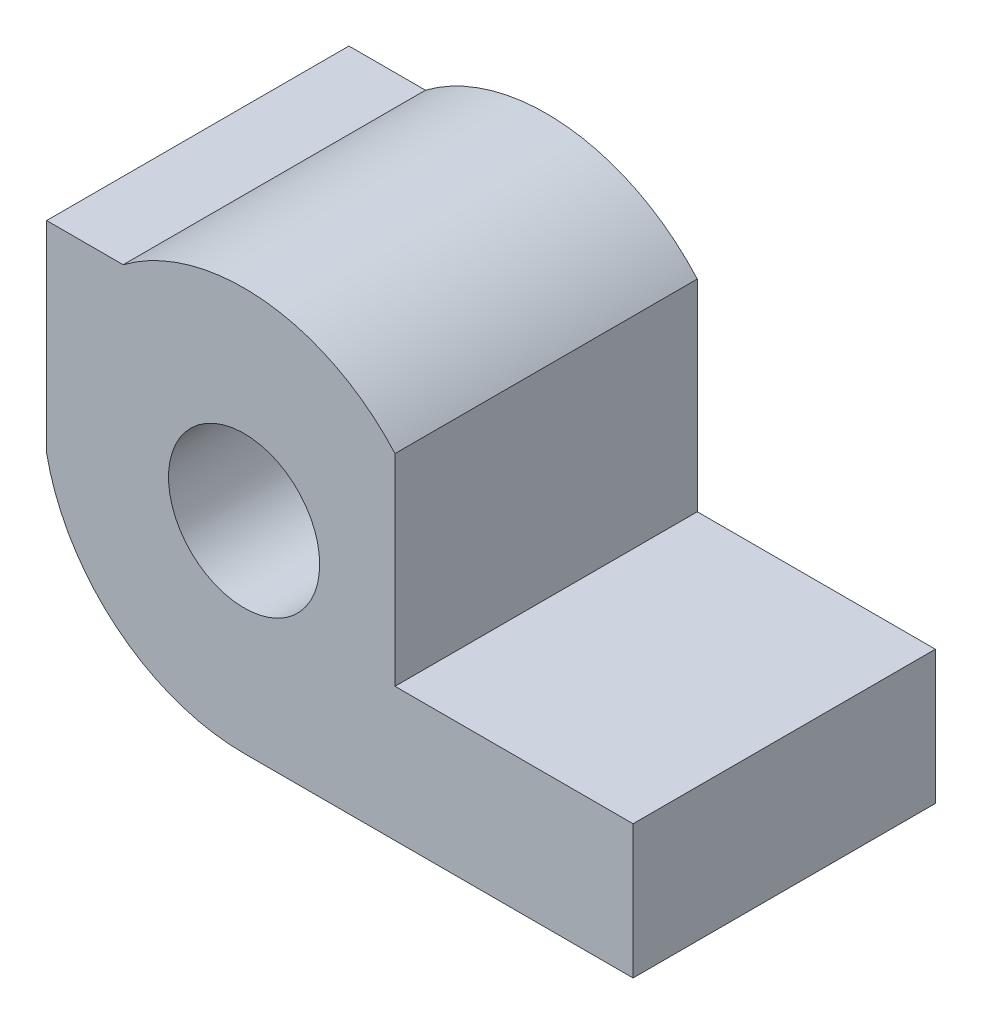
ISO-10303-21;
HEADER;
FILE_DESCRIPTION(('STEP AP214'),'2;1');
FILE_NAME('part.step','',(''),(''),'','','');
FILE_SCHEMA(('AUTOMOTIVE_DESIGN { 1 0 10303 214 1 1 1 1 }'));
ENDSEC;
DATA;
#1=APPLICATION_CONTEXT('core data for automotive mechanical design processes');
#2=APPLICATION_PROTOCOL_DEFINITION('international standard','automotive_design',2000,#1);
#3=PRODUCT_CONTEXT('',#1,'mechanical');
#4=PRODUCT('Part','Part','',(#3));
#5=PRODUCT_RELATED_PRODUCT_CATEGORY('part','',(#4));
#6=PRODUCT_DEFINITION_FORMATION('','',#4);
#7=PRODUCT_DEFINITION_CONTEXT('part definition',#1,'design');
#8=PRODUCT_DEFINITION('design','',#6,#7);
#9=PRODUCT_DEFINITION_SHAPE('','',#8);
#10=(LENGTH_UNIT() NAMED_UNIT(*) SI_UNIT(.MILLI.,.METRE.));
#11=(NAMED_UNIT(*) PLANE_ANGLE_UNIT() SI_UNIT($,.RADIAN.));
#12=(NAMED_UNIT(*) SI_UNIT($,.STERADIAN.) SOLID_ANGLE_UNIT());
#13=UNCERTAINTY_MEASURE_WITH_UNIT(LENGTH_MEASURE(1.E-05),#10,'distance_accuracy_value','');
#14=(GEOMETRIC_REPRESENTATION_CONTEXT(3) GLOBAL_UNCERTAINTY_ASSIGNED_CONTEXT((#13)) GLOBAL_UNIT_ASSIGNED_CONTEXT((#10,
#11,#12)) REPRESENTATION_CONTEXT('',''));
#15=CARTESIAN_POINT('',(0.,0.,0.));
#16=DIRECTION('',(0.,0.,1.));
#17=DIRECTION('',(1.,0.,0.));
#18=AXIS2_PLACEMENT_3D('',#15,#16,#17);
#19=CARTESIAN_POINT('',(0.599591794226535,0.,6.));
#20=DIRECTION('',(0.,0.,1.));
#21=DIRECTION('',(1.,0.,0.));
#22=AXIS2_PLACEMENT_3D('',#19,#20,#21);
#23=PLANE('',#22);
#24=CARTESIAN_POINT('',(0.599591794226535,0.,6.));
#25=DIRECTION('',(0.,0.,1.));
#26=DIRECTION('',(1.,0.,0.));
#27=AXIS2_PLACEMENT_3D('',#24,#25,#26);
#28=CIRCLE('',#27,4.);
#29=CARTESIAN_POINT('',(-3.31959179422655,-0.800000000000001,6.));
#30=VERTEX_POINT('',#29);
#31=CARTESIAN_POINT('',(0.599591794226577,-4.,6.));
#32=VERTEX_POINT('',#31);
#33=EDGE_CURVE('E144',#30,#32,#28,.T.);
#34=ORIENTED_EDGE('',*,*,#33,.T.);
#35=DIRECTION('',(1.,0.,0.));
#36=VECTOR('',#35,1.);
#37=CARTESIAN_POINT('',(8.31959179422655,-4.,6.));
#38=LINE('',#37,#36);
#39=CARTESIAN_POINT('',(8.31959179422655,-4.,6.));
#40=VERTEX_POINT('',#39);
#41=EDGE_CURVE('E92',#32,#40,#38,.T.);
#42=ORIENTED_EDGE('',*,*,#41,.T.);
#43=DIRECTION('',(0.,1.,0.));
#44=VECTOR('',#43,1.);
#45=CARTESIAN_POINT('',(8.31959179422654,-1.34852681521862,6.));
#46=LINE('',#45,#44);
#47=CARTESIAN_POINT('',(8.31959179422654,-1.34852681521862,6.));
#48=VERTEX_POINT('',#47);
#49=EDGE_CURVE('E159',#40,#48,#46,.T.);
#50=ORIENTED_EDGE('',*,*,#49,.T.);
#51=DIRECTION('',(-1.,0.,0.));
#52=VECTOR('',#51,1.);
#53=CARTESIAN_POINT('',(3.59453585887705,-1.34852681521862,6.));
#54=LINE('',#53,#52);
#55=CARTESIAN_POINT('',(3.59453585887705,-1.34852681521862,6.));
#56=VERTEX_POINT('',#55);
#57=EDGE_CURVE('E172',#48,#56,#54,.T.);
#58=ORIENTED_EDGE('',*,*,#57,.T.);
#59=DIRECTION('',(0.,1.,0.));
#60=VECTOR('',#59,1.);
#61=CARTESIAN_POINT('',(3.59453585887705,2.65147318478138,6.));
#62=LINE('',#61,#60);
#63=CARTESIAN_POINT('',(3.59453585887705,2.65147318478138,6.));
#64=VERTEX_POINT('',#63);
#65=EDGE_CURVE('E111',#56,#64,#62,.T.);
#66=ORIENTED_EDGE('',*,*,#65,.T.);
#67=CARTESIAN_POINT('',(0.599591794226535,0.,6.));
#68=DIRECTION('',(0.,0.,1.));
#69=DIRECTION('',(1.,0.,0.));
#70=AXIS2_PLACEMENT_3D('',#67,#68,#69);
#71=CIRCLE('',#70,4.);
#72=CARTESIAN_POINT('',(-1.80040820577347,3.2,6.));
#73=VERTEX_POINT('',#72);
#74=EDGE_CURVE('E105',#64,#73,#71,.T.);
#75=ORIENTED_EDGE('',*,*,#74,.T.);
#76=DIRECTION('',(-1.,0.,0.));
#77=VECTOR('',#76,1.);
#78=CARTESIAN_POINT('',(-3.31959179422655,3.2,6.));
#79=LINE('',#78,#77);
#80=CARTESIAN_POINT('',(-3.31959179422655,3.2,6.));
#81=VERTEX_POINT('',#80);
#82=EDGE_CURVE('E109',#73,#81,#79,.T.);
#83=ORIENTED_EDGE('',*,*,#82,.T.);
#84=DIRECTION('',(0.,-1.,0.));
#85=VECTOR('',#84,1.);
#86=CARTESIAN_POINT('',(-3.31959179422655,3.2,6.));
#87=LINE('',#86,#85);
#88=EDGE_CURVE('E49',#81,#30,#87,.T.);
#89=ORIENTED_EDGE('',*,*,#88,.T.);
#90=EDGE_LOOP('',(#34,#42,#50,#58,#66,#75,#83,#89));
#91=FACE_BOUND('',#90,.T.);
#92=CARTESIAN_POINT('',(0.599591794226535,0.,6.));
#93=DIRECTION('',(0.,0.,1.));
#94=DIRECTION('',(1.,0.,0.));
#95=AXIS2_PLACEMENT_3D('',#92,#93,#94);
#96=CIRCLE('',#95,1.5);
#97=CARTESIAN_POINT('',(2.09959179422654,0.,6.));
#98=VERTEX_POINT('',#97);
#99=EDGE_CURVE('E133',#98,#98,#96,.T.);
#100=ORIENTED_EDGE('',*,*,#99,.F.);
#101=EDGE_LOOP('',(#100));
#102=FACE_BOUND('',#101,.T.);
#103=ADVANCED_FACE('F32',(#91,#102),#23,.T.);
#104=CARTESIAN_POINT('',(0.599591794226535,0.,0.));
#105=DIRECTION('',(0.,0.,1.));
#106=DIRECTION('',(1.,0.,0.));
#107=AXIS2_PLACEMENT_3D('',#104,#105,#106);
#108=PLANE('',#107);
#109=CARTESIAN_POINT('',(0.599591794226535,0.,0.));
#110=DIRECTION('',(0.,0.,1.));
#111=DIRECTION('',(1.,0.,0.));
#112=AXIS2_PLACEMENT_3D('',#109,#110,#111);
#113=CIRCLE('',#112,4.);
#114=CARTESIAN_POINT('',(-3.31959179422655,-0.800000000000001,0.));
#115=VERTEX_POINT('',#114);
#116=CARTESIAN_POINT('',(0.599591794226577,-4.,0.));
#117=VERTEX_POINT('',#116);
#118=EDGE_CURVE('E129',#115,#117,#113,.T.);
#119=ORIENTED_EDGE('',*,*,#118,.F.);
#120=DIRECTION('',(0.,-1.,0.));
#121=VECTOR('',#120,1.);
#122=CARTESIAN_POINT('',(-3.31959179422655,3.2,0.));
#123=LINE('',#122,#121);
#124=CARTESIAN_POINT('',(-3.31959179422655,3.2,0.));
#125=VERTEX_POINT('',#124);
#126=EDGE_CURVE('E84',#125,#115,#123,.T.);
#127=ORIENTED_EDGE('',*,*,#126,.F.);
#128=DIRECTION('',(-1.,0.,0.));
#129=VECTOR('',#128,1.);
#130=CARTESIAN_POINT('',(-3.31959179422655,3.2,0.));
#131=LINE('',#130,#129);
#132=CARTESIAN_POINT('',(-1.80040820577347,3.2,0.));
#133=VERTEX_POINT('',#132);
#134=EDGE_CURVE('E78',#133,#125,#131,.T.);
#135=ORIENTED_EDGE('',*,*,#134,.F.);
#136=CARTESIAN_POINT('',(0.599591794226535,0.,0.));
#137=DIRECTION('',(0.,0.,1.));
#138=DIRECTION('',(1.,0.,0.));
#139=AXIS2_PLACEMENT_3D('',#136,#137,#138);
#140=CIRCLE('',#139,4.);
#141=CARTESIAN_POINT('',(3.59453585887705,2.65147318478138,0.));
#142=VERTEX_POINT('',#141);
#143=EDGE_CURVE('E119',#142,#133,#140,.T.);
#144=ORIENTED_EDGE('',*,*,#143,.F.);
#145=DIRECTION('',(0.,1.,0.));
#146=VECTOR('',#145,1.);
#147=CARTESIAN_POINT('',(3.59453585887705,2.65147318478138,0.));
#148=LINE('',#147,#146);
#149=CARTESIAN_POINT('',(3.59453585887705,-1.34852681521862,0.));
#150=VERTEX_POINT('',#149);
#151=EDGE_CURVE('E139',#150,#142,#148,.T.);
#152=ORIENTED_EDGE('',*,*,#151,.F.);
#153=DIRECTION('',(-1.,0.,0.));
#154=VECTOR('',#153,1.);
#155=CARTESIAN_POINT('',(3.59453585887705,-1.34852681521862,0.));
#156=LINE('',#155,#154);
#157=CARTESIAN_POINT('',(8.31959179422654,-1.34852681521862,0.));
#158=VERTEX_POINT('',#157);
#159=EDGE_CURVE('E137',#158,#150,#156,.T.);
#160=ORIENTED_EDGE('',*,*,#159,.F.);
#161=DIRECTION('',(0.,1.,0.));
#162=VECTOR('',#161,1.);
#163=CARTESIAN_POINT('',(8.31959179422654,-1.34852681521862,0.));
#164=LINE('',#163,#162);
#165=CARTESIAN_POINT('',(8.31959179422655,-4.,0.));
#166=VERTEX_POINT('',#165);
#167=EDGE_CURVE('E135',#166,#158,#164,.T.);
#168=ORIENTED_EDGE('',*,*,#167,.F.);
#169=DIRECTION('',(1.,0.,0.));
#170=VECTOR('',#169,1.);
#171=CARTESIAN_POINT('',(8.31959179422655,-4.,0.));
#172=LINE('',#171,#170);
#173=EDGE_CURVE('E132',#117,#166,#172,.T.);
#174=ORIENTED_EDGE('',*,*,#173,.F.);
#175=EDGE_LOOP('',(#119,#127,#135,#144,#152,#160,#168,#174));
#176=FACE_BOUND('',#175,.T.);
#177=CARTESIAN_POINT('',(0.599591794226535,0.,0.));
#178=DIRECTION('',(0.,0.,1.));
#179=DIRECTION('',(1.,0.,0.));
#180=AXIS2_PLACEMENT_3D('',#177,#178,#179);
#181=CIRCLE('',#180,1.5);
#182=CARTESIAN_POINT('',(2.09959179422654,0.,0.));
#183=VERTEX_POINT('',#182);
#184=EDGE_CURVE('E178',#183,#183,#181,.T.);
#185=ORIENTED_EDGE('',*,*,#184,.T.);
#186=EDGE_LOOP('',(#185));
#187=FACE_BOUND('',#186,.T.);
#188=ADVANCED_FACE('F163',(#176,#187),#108,.F.);
#189=CARTESIAN_POINT('',(0.599591794226535,0.,6.));
#190=DIRECTION('',(0.,0.,-1.));
#191=DIRECTION('',(-1.,0.,0.));
#192=AXIS2_PLACEMENT_3D('',#189,#190,#191);
#193=CYLINDRICAL_SURFACE('',#192,4.);
#194=ORIENTED_EDGE('',*,*,#118,.T.);
#195=DIRECTION('',(0.,0.,-1.));
#196=VECTOR('',#195,1.);
#197=CARTESIAN_POINT('',(0.599591794226577,-4.,6.));
#198=LINE('',#197,#196);
#199=EDGE_CURVE('E11',#32,#117,#198,.T.);
#200=ORIENTED_EDGE('',*,*,#199,.F.);
#201=ORIENTED_EDGE('',*,*,#33,.F.);
#202=DIRECTION('',(0.,0.,-1.));
#203=VECTOR('',#202,1.);
#204=CARTESIAN_POINT('',(-3.31959179422655,-0.800000000000001,6.));
#205=LINE('',#204,#203);
#206=EDGE_CURVE('E125',#30,#115,#205,.T.);
#207=ORIENTED_EDGE('',*,*,#206,.T.);
#208=EDGE_LOOP('',(#194,#200,#201,#207));
#209=FACE_BOUND('',#208,.T.);
#210=ADVANCED_FACE('F34',(#209),#193,.T.);
#211=CARTESIAN_POINT('',(8.31959179422655,-4.,6.));
#212=DIRECTION('',(0.,1.,0.));
#213=DIRECTION('',(0.,0.,1.));
#214=AXIS2_PLACEMENT_3D('',#211,#212,#213);
#215=PLANE('',#214);
#216=ORIENTED_EDGE('',*,*,#173,.T.);
#217=DIRECTION('',(0.,0.,-1.));
#218=VECTOR('',#217,1.);
#219=CARTESIAN_POINT('',(8.31959179422655,-4.,6.));
#220=LINE('',#219,#218);
#221=EDGE_CURVE('E41',#40,#166,#220,.T.);
#222=ORIENTED_EDGE('',*,*,#221,.F.);
#223=ORIENTED_EDGE('',*,*,#41,.F.);
#224=ORIENTED_EDGE('',*,*,#199,.T.);
#225=EDGE_LOOP('',(#216,#222,#223,#224));
#226=FACE_BOUND('',#225,.T.);
#227=ADVANCED_FACE('F206',(#226),#215,.F.);
#228=CARTESIAN_POINT('',(8.31959179422654,-1.34852681521862,6.));
#229=DIRECTION('',(-1.,0.,0.));
#230=DIRECTION('',(0.,-1.,0.));
#231=AXIS2_PLACEMENT_3D('',#228,#229,#230);
#232=PLANE('',#231);
#233=ORIENTED_EDGE('',*,*,#167,.T.);
#234=DIRECTION('',(0.,0.,-1.));
#235=VECTOR('',#234,1.);
#236=CARTESIAN_POINT('',(8.31959179422654,-1.34852681521862,6.));
#237=LINE('',#236,#235);
#238=EDGE_CURVE('E151',#48,#158,#237,.T.);
#239=ORIENTED_EDGE('',*,*,#238,.F.);
#240=ORIENTED_EDGE('',*,*,#49,.F.);
#241=ORIENTED_EDGE('',*,*,#221,.T.);
#242=EDGE_LOOP('',(#233,#239,#240,#241));
#243=FACE_BOUND('',#242,.T.);
#244=ADVANCED_FACE('F157',(#243),#232,.F.);
#245=CARTESIAN_POINT('',(3.59453585887705,-1.34852681521862,6.));
#246=DIRECTION('',(0.,-1.,0.));
#247=DIRECTION('',(1.,0.,0.));
#248=AXIS2_PLACEMENT_3D('',#245,#246,#247);
#249=PLANE('',#248);
#250=ORIENTED_EDGE('',*,*,#159,.T.);
#251=DIRECTION('',(0.,0.,-1.));
#252=VECTOR('',#251,1.);
#253=CARTESIAN_POINT('',(3.59453585887705,-1.34852681521862,6.));
#254=LINE('',#253,#252);
#255=EDGE_CURVE('E148',#56,#150,#254,.T.);
#256=ORIENTED_EDGE('',*,*,#255,.F.);
#257=ORIENTED_EDGE('',*,*,#57,.F.);
#258=ORIENTED_EDGE('',*,*,#238,.T.);
#259=EDGE_LOOP('',(#250,#256,#257,#258));
#260=FACE_BOUND('',#259,.T.);
#261=ADVANCED_FACE('F168',(#260),#249,.F.);
#262=CARTESIAN_POINT('',(3.59453585887705,2.65147318478138,6.));
#263=DIRECTION('',(-1.,0.,0.));
#264=DIRECTION('',(0.,-1.,0.));
#265=AXIS2_PLACEMENT_3D('',#262,#263,#264);
#266=PLANE('',#265);
#267=ORIENTED_EDGE('',*,*,#151,.T.);
#268=DIRECTION('',(0.,0.,-1.));
#269=VECTOR('',#268,1.);
#270=CARTESIAN_POINT('',(3.59453585887705,2.65147318478138,6.));
#271=LINE('',#270,#269);
#272=EDGE_CURVE('E120',#64,#142,#271,.T.);
#273=ORIENTED_EDGE('',*,*,#272,.F.);
#274=ORIENTED_EDGE('',*,*,#65,.F.);
#275=ORIENTED_EDGE('',*,*,#255,.T.);
#276=EDGE_LOOP('',(#267,#273,#274,#275));
#277=FACE_BOUND('',#276,.T.);
#278=ADVANCED_FACE('F171',(#277),#266,.F.);
#279=CARTESIAN_POINT('',(0.599591794226535,0.,6.));
#280=DIRECTION('',(0.,0.,-1.));
#281=DIRECTION('',(-1.,0.,0.));
#282=AXIS2_PLACEMENT_3D('',#279,#280,#281);
#283=CYLINDRICAL_SURFACE('',#282,4.);
#284=ORIENTED_EDGE('',*,*,#143,.T.);
#285=DIRECTION('',(0.,0.,-1.));
#286=VECTOR('',#285,1.);
#287=CARTESIAN_POINT('',(-1.80040820577347,3.2,6.));
#288=LINE('',#287,#286);
#289=EDGE_CURVE('E116',#73,#133,#288,.T.);
#290=ORIENTED_EDGE('',*,*,#289,.F.);
#291=ORIENTED_EDGE('',*,*,#74,.F.);
#292=ORIENTED_EDGE('',*,*,#272,.T.);
#293=EDGE_LOOP('',(#284,#290,#291,#292));
#294=FACE_BOUND('',#293,.T.);
#295=ADVANCED_FACE('F117',(#294),#283,.T.);
#296=CARTESIAN_POINT('',(-3.31959179422655,3.2,6.));
#297=DIRECTION('',(0.,-1.,0.));
#298=DIRECTION('',(0.,0.,-1.));
#299=AXIS2_PLACEMENT_3D('',#296,#297,#298);
#300=PLANE('',#299);
#301=ORIENTED_EDGE('',*,*,#134,.T.);
#302=DIRECTION('',(0.,0.,-1.));
#303=VECTOR('',#302,1.);
#304=CARTESIAN_POINT('',(-3.31959179422655,3.2,6.));
#305=LINE('',#304,#303);
#306=EDGE_CURVE('E121',#81,#125,#305,.T.);
#307=ORIENTED_EDGE('',*,*,#306,.F.);
#308=ORIENTED_EDGE('',*,*,#82,.F.);
#309=ORIENTED_EDGE('',*,*,#289,.T.);
#310=EDGE_LOOP('',(#301,#307,#308,#309));
#311=FACE_BOUND('',#310,.T.);
#312=ADVANCED_FACE('F123',(#311),#300,.F.);
#313=CARTESIAN_POINT('',(-3.31959179422655,3.2,6.));
#314=DIRECTION('',(1.,0.,0.));
#315=DIRECTION('',(0.,0.,-1.));
#316=AXIS2_PLACEMENT_3D('',#313,#314,#315);
#317=PLANE('',#316);
#318=ORIENTED_EDGE('',*,*,#126,.T.);
#319=ORIENTED_EDGE('',*,*,#206,.F.);
#320=ORIENTED_EDGE('',*,*,#88,.F.);
#321=ORIENTED_EDGE('',*,*,#306,.T.);
#322=EDGE_LOOP('',(#318,#319,#320,#321));
#323=FACE_BOUND('',#322,.T.);
#324=ADVANCED_FACE('F194',(#323),#317,.F.);
#325=CARTESIAN_POINT('',(0.599591794226535,0.,6.));
#326=DIRECTION('',(0.,0.,-1.));
#327=DIRECTION('',(-1.,0.,0.));
#328=AXIS2_PLACEMENT_3D('',#325,#326,#327);
#329=CYLINDRICAL_SURFACE('',#328,1.5);
#330=ORIENTED_EDGE('',*,*,#99,.T.);
#331=EDGE_LOOP('',(#330));
#332=FACE_BOUND('',#331,.T.);
#333=ORIENTED_EDGE('',*,*,#184,.F.);
#334=EDGE_LOOP('',(#333));
#335=FACE_BOUND('',#334,.T.);
#336=ADVANCED_FACE('F184',(#332,#335),#329,.F.);
#337=CLOSED_SHELL('',(#103,#188,#210,#227,#244,#261,#278,#295,#312,#324,#336));
#338=MANIFOLD_SOLID_BREP('B2',#337);
#339=ADVANCED_BREP_SHAPE_REPRESENTATION('',(#18,#338),#14);
#340=SHAPE_DEFINITION_REPRESENTATION(#9,#339);
ENDSEC;
END-ISO-10303-21;
